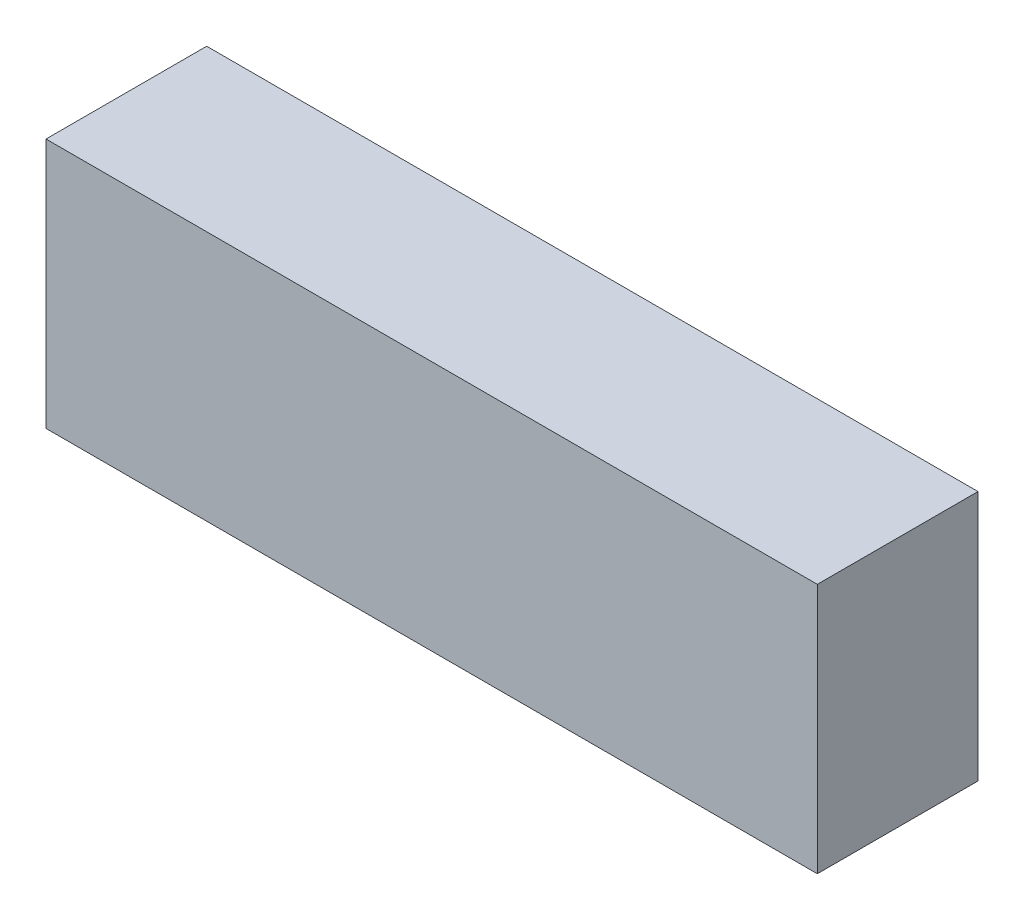
ISO-10303-21;
HEADER;
FILE_DESCRIPTION(('STEP AP214'),'2;1');
FILE_NAME('part.step','',(''),(''),'','','');
FILE_SCHEMA(('AUTOMOTIVE_DESIGN { 1 0 10303 214 1 1 1 1 }'));
ENDSEC;
DATA;
#1=APPLICATION_CONTEXT('core data for automotive mechanical design processes');
#2=APPLICATION_PROTOCOL_DEFINITION('international standard','automotive_design',2000,#1);
#3=PRODUCT_CONTEXT('',#1,'mechanical');
#4=PRODUCT('Part','Part','',(#3));
#5=PRODUCT_RELATED_PRODUCT_CATEGORY('part','',(#4));
#6=PRODUCT_DEFINITION_FORMATION('','',#4);
#7=PRODUCT_DEFINITION_CONTEXT('part definition',#1,'design');
#8=PRODUCT_DEFINITION('design','',#6,#7);
#9=PRODUCT_DEFINITION_SHAPE('','',#8);
#10=(LENGTH_UNIT() NAMED_UNIT(*) SI_UNIT(.MILLI.,.METRE.));
#11=(NAMED_UNIT(*) PLANE_ANGLE_UNIT() SI_UNIT($,.RADIAN.));
#12=(NAMED_UNIT(*) SI_UNIT($,.STERADIAN.) SOLID_ANGLE_UNIT());
#13=UNCERTAINTY_MEASURE_WITH_UNIT(LENGTH_MEASURE(1.E-05),#10,'distance_accuracy_value','');
#14=(GEOMETRIC_REPRESENTATION_CONTEXT(3) GLOBAL_UNCERTAINTY_ASSIGNED_CONTEXT((#13)) GLOBAL_UNIT_ASSIGNED_CONTEXT((#10,
#11,#12)) REPRESENTATION_CONTEXT('',''));
#15=CARTESIAN_POINT('',(0.,0.,0.));
#16=DIRECTION('',(0.,0.,1.));
#17=DIRECTION('',(1.,0.,0.));
#18=AXIS2_PLACEMENT_3D('',#15,#16,#17);
#19=CARTESIAN_POINT('',(-60.,39.,12.5));
#20=DIRECTION('',(1.,0.,0.));
#21=DIRECTION('',(0.,0.,-1.));
#22=AXIS2_PLACEMENT_3D('',#19,#20,#21);
#23=PLANE('',#22);
#24=DIRECTION('',(0.,0.,1.));
#25=VECTOR('',#24,1.);
#26=CARTESIAN_POINT('',(-60.,0.,12.5));
#27=LINE('',#26,#25);
#28=CARTESIAN_POINT('',(-60.,0.,-12.5));
#29=VERTEX_POINT('',#28);
#30=CARTESIAN_POINT('',(-60.,0.,12.5));
#31=VERTEX_POINT('',#30);
#32=EDGE_CURVE('E114',#29,#31,#27,.T.);
#33=ORIENTED_EDGE('',*,*,#32,.T.);
#34=DIRECTION('',(0.,-1.,0.));
#35=VECTOR('',#34,1.);
#36=CARTESIAN_POINT('',(-60.,39.,12.5));
#37=LINE('',#36,#35);
#38=CARTESIAN_POINT('',(-60.,39.,12.5));
#39=VERTEX_POINT('',#38);
#40=EDGE_CURVE('E11',#39,#31,#37,.T.);
#41=ORIENTED_EDGE('',*,*,#40,.F.);
#42=DIRECTION('',(0.,0.,1.));
#43=VECTOR('',#42,1.);
#44=CARTESIAN_POINT('',(-60.,39.,12.5));
#45=LINE('',#44,#43);
#46=CARTESIAN_POINT('',(-60.,39.,-12.5));
#47=VERTEX_POINT('',#46);
#48=EDGE_CURVE('E92',#47,#39,#45,.T.);
#49=ORIENTED_EDGE('',*,*,#48,.F.);
#50=DIRECTION('',(0.,-1.,0.));
#51=VECTOR('',#50,1.);
#52=CARTESIAN_POINT('',(-60.,39.,-12.5));
#53=LINE('',#52,#51);
#54=EDGE_CURVE('E108',#47,#29,#53,.T.);
#55=ORIENTED_EDGE('',*,*,#54,.T.);
#56=EDGE_LOOP('',(#33,#41,#49,#55));
#57=FACE_BOUND('',#56,.T.);
#58=ADVANCED_FACE('F43',(#57),#23,.F.);
#59=CARTESIAN_POINT('',(-60.,39.,12.5));
#60=DIRECTION('',(0.,0.,-1.));
#61=DIRECTION('',(-1.,0.,0.));
#62=AXIS2_PLACEMENT_3D('',#59,#60,#61);
#63=PLANE('',#62);
#64=DIRECTION('',(1.,0.,0.));
#65=VECTOR('',#64,1.);
#66=CARTESIAN_POINT('',(-60.,0.,12.5));
#67=LINE('',#66,#65);
#68=CARTESIAN_POINT('',(60.,0.,12.5));
#69=VERTEX_POINT('',#68);
#70=EDGE_CURVE('E99',#31,#69,#67,.T.);
#71=ORIENTED_EDGE('',*,*,#70,.T.);
#72=DIRECTION('',(0.,-1.,0.));
#73=VECTOR('',#72,1.);
#74=CARTESIAN_POINT('',(60.,39.,12.5));
#75=LINE('',#74,#73);
#76=CARTESIAN_POINT('',(60.,39.,12.5));
#77=VERTEX_POINT('',#76);
#78=EDGE_CURVE('E55',#77,#69,#75,.T.);
#79=ORIENTED_EDGE('',*,*,#78,.F.);
#80=DIRECTION('',(1.,0.,0.));
#81=VECTOR('',#80,1.);
#82=CARTESIAN_POINT('',(-60.,39.,12.5));
#83=LINE('',#82,#81);
#84=EDGE_CURVE('E89',#39,#77,#83,.T.);
#85=ORIENTED_EDGE('',*,*,#84,.F.);
#86=ORIENTED_EDGE('',*,*,#40,.T.);
#87=EDGE_LOOP('',(#71,#79,#85,#86));
#88=FACE_BOUND('',#87,.T.);
#89=ADVANCED_FACE('F97',(#88),#63,.F.);
#90=CARTESIAN_POINT('',(60.,39.,12.5));
#91=DIRECTION('',(-1.,0.,0.));
#92=DIRECTION('',(0.,0.,1.));
#93=AXIS2_PLACEMENT_3D('',#90,#91,#92);
#94=PLANE('',#93);
#95=DIRECTION('',(0.,0.,-1.));
#96=VECTOR('',#95,1.);
#97=CARTESIAN_POINT('',(60.,0.,12.5));
#98=LINE('',#97,#96);
#99=CARTESIAN_POINT('',(60.,0.,-12.5));
#100=VERTEX_POINT('',#99);
#101=EDGE_CURVE('E76',#69,#100,#98,.T.);
#102=ORIENTED_EDGE('',*,*,#101,.T.);
#103=DIRECTION('',(0.,-1.,0.));
#104=VECTOR('',#103,1.);
#105=CARTESIAN_POINT('',(60.,39.,-12.5));
#106=LINE('',#105,#104);
#107=CARTESIAN_POINT('',(60.,39.,-12.5));
#108=VERTEX_POINT('',#107);
#109=EDGE_CURVE('E105',#108,#100,#106,.T.);
#110=ORIENTED_EDGE('',*,*,#109,.F.);
#111=DIRECTION('',(0.,0.,-1.));
#112=VECTOR('',#111,1.);
#113=CARTESIAN_POINT('',(60.,39.,12.5));
#114=LINE('',#113,#112);
#115=EDGE_CURVE('E91',#77,#108,#114,.T.);
#116=ORIENTED_EDGE('',*,*,#115,.F.);
#117=ORIENTED_EDGE('',*,*,#78,.T.);
#118=EDGE_LOOP('',(#102,#110,#116,#117));
#119=FACE_BOUND('',#118,.T.);
#120=ADVANCED_FACE('F103',(#119),#94,.F.);
#121=CARTESIAN_POINT('',(-60.,39.,-12.5));
#122=DIRECTION('',(0.,0.,1.));
#123=DIRECTION('',(1.,0.,0.));
#124=AXIS2_PLACEMENT_3D('',#121,#122,#123);
#125=PLANE('',#124);
#126=DIRECTION('',(-1.,0.,0.));
#127=VECTOR('',#126,1.);
#128=CARTESIAN_POINT('',(-60.,0.,-12.5));
#129=LINE('',#128,#127);
#130=EDGE_CURVE('E82',#100,#29,#129,.T.);
#131=ORIENTED_EDGE('',*,*,#130,.T.);
#132=ORIENTED_EDGE('',*,*,#54,.F.);
#133=DIRECTION('',(-1.,0.,0.));
#134=VECTOR('',#133,1.);
#135=CARTESIAN_POINT('',(-60.,39.,-12.5));
#136=LINE('',#135,#134);
#137=EDGE_CURVE('E58',#108,#47,#136,.T.);
#138=ORIENTED_EDGE('',*,*,#137,.F.);
#139=ORIENTED_EDGE('',*,*,#109,.T.);
#140=EDGE_LOOP('',(#131,#132,#138,#139));
#141=FACE_BOUND('',#140,.T.);
#142=ADVANCED_FACE('F123',(#141),#125,.F.);
#143=CARTESIAN_POINT('',(0.,39.,0.));
#144=DIRECTION('',(0.,-1.,0.));
#145=DIRECTION('',(0.,0.,-1.));
#146=AXIS2_PLACEMENT_3D('',#143,#144,#145);
#147=PLANE('',#146);
#148=ORIENTED_EDGE('',*,*,#48,.T.);
#149=ORIENTED_EDGE('',*,*,#84,.T.);
#150=ORIENTED_EDGE('',*,*,#115,.T.);
#151=ORIENTED_EDGE('',*,*,#137,.T.);
#152=EDGE_LOOP('',(#148,#149,#150,#151));
#153=FACE_BOUND('',#152,.T.);
#154=ADVANCED_FACE('F93',(#153),#147,.F.);
#155=CARTESIAN_POINT('',(0.,0.,0.));
#156=DIRECTION('',(0.,-1.,0.));
#157=DIRECTION('',(0.,0.,-1.));
#158=AXIS2_PLACEMENT_3D('',#155,#156,#157);
#159=PLANE('',#158);
#160=ORIENTED_EDGE('',*,*,#32,.F.);
#161=ORIENTED_EDGE('',*,*,#130,.F.);
#162=ORIENTED_EDGE('',*,*,#101,.F.);
#163=ORIENTED_EDGE('',*,*,#70,.F.);
#164=EDGE_LOOP('',(#160,#161,#162,#163));
#165=FACE_BOUND('',#164,.T.);
#166=ADVANCED_FACE('F130',(#165),#159,.T.);
#167=CLOSED_SHELL('',(#58,#89,#120,#142,#154,#166));
#168=MANIFOLD_SOLID_BREP('B2',#167);
#169=ADVANCED_BREP_SHAPE_REPRESENTATION('',(#18,#168),#14);
#170=SHAPE_DEFINITION_REPRESENTATION(#9,#169);
ENDSEC;
END-ISO-10303-21;
